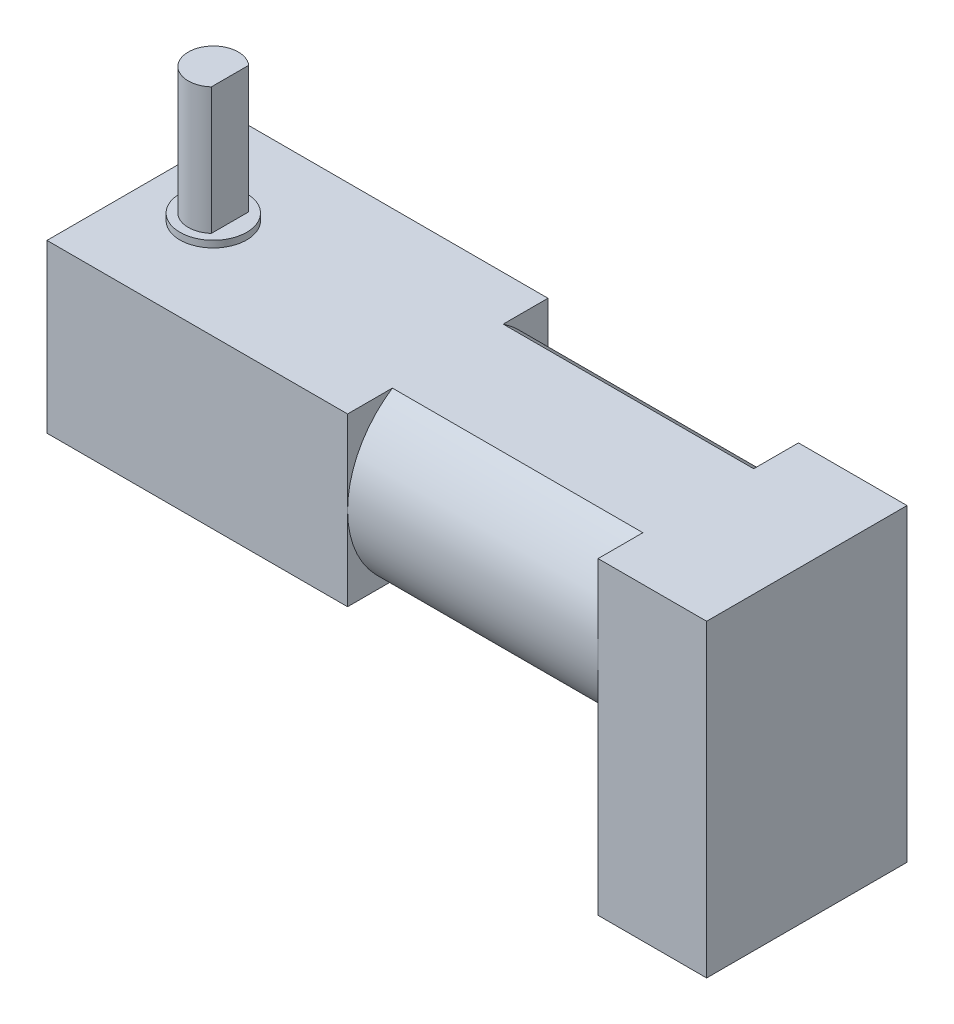
ISO-10303-21;
HEADER;
FILE_DESCRIPTION(('STEP AP214'),'2;1');
FILE_NAME('part.step','',(''),(''),'','','');
FILE_SCHEMA(('AUTOMOTIVE_DESIGN { 1 0 10303 214 1 1 1 1 }'));
ENDSEC;
DATA;
#1=APPLICATION_CONTEXT('core data for automotive mechanical design processes');
#2=APPLICATION_PROTOCOL_DEFINITION('international standard','automotive_design',2000,#1);
#3=PRODUCT_CONTEXT('',#1,'mechanical');
#4=PRODUCT('Part','Part','',(#3));
#5=PRODUCT_RELATED_PRODUCT_CATEGORY('part','',(#4));
#6=PRODUCT_DEFINITION_FORMATION('','',#4);
#7=PRODUCT_DEFINITION_CONTEXT('part definition',#1,'design');
#8=PRODUCT_DEFINITION('design','',#6,#7);
#9=PRODUCT_DEFINITION_SHAPE('','',#8);
#10=(LENGTH_UNIT() NAMED_UNIT(*) SI_UNIT(.MILLI.,.METRE.));
#11=(NAMED_UNIT(*) PLANE_ANGLE_UNIT() SI_UNIT($,.RADIAN.));
#12=(NAMED_UNIT(*) SI_UNIT($,.STERADIAN.) SOLID_ANGLE_UNIT());
#13=UNCERTAINTY_MEASURE_WITH_UNIT(LENGTH_MEASURE(1.E-05),#10,'distance_accuracy_value','');
#14=(GEOMETRIC_REPRESENTATION_CONTEXT(3) GLOBAL_UNCERTAINTY_ASSIGNED_CONTEXT((#13)) GLOBAL_UNIT_ASSIGNED_CONTEXT((#10,
#11,#12)) REPRESENTATION_CONTEXT('',''));
#15=CARTESIAN_POINT('',(0.,0.,0.));
#16=DIRECTION('',(0.,0.,1.));
#17=DIRECTION('',(1.,0.,0.));
#18=AXIS2_PLACEMENT_3D('',#15,#16,#17);
#19=CARTESIAN_POINT('',(18.,10.,0.));
#20=DIRECTION('',(-1.,0.,0.));
#21=DIRECTION('',(0.,0.,1.));
#22=AXIS2_PLACEMENT_3D('',#19,#20,#21);
#23=PLANE('',#22);
#24=CARTESIAN_POINT('',(18.,5.,-6.));
#25=DIRECTION('',(1.,0.,0.));
#26=DIRECTION('',(0.,0.,-1.));
#27=AXIS2_PLACEMENT_3D('',#24,#25,#26);
#28=CIRCLE('',#27,6.);
#29=CARTESIAN_POINT('',(18.,10.,-2.6833752096446));
#30=VERTEX_POINT('',#29);
#31=CARTESIAN_POINT('',(18.,5.,0.));
#32=VERTEX_POINT('',#31);
#33=EDGE_CURVE('E209',#30,#32,#28,.T.);
#34=ORIENTED_EDGE('',*,*,#33,.F.);
#35=DIRECTION('',(0.,0.,-1.));
#36=VECTOR('',#35,1.);
#37=CARTESIAN_POINT('',(18.,10.,0.));
#38=LINE('',#37,#36);
#39=CARTESIAN_POINT('',(18.,10.,0.));
#40=VERTEX_POINT('',#39);
#41=EDGE_CURVE('E243',#40,#30,#38,.T.);
#42=ORIENTED_EDGE('',*,*,#41,.F.);
#43=DIRECTION('',(0.,-1.,0.));
#44=VECTOR('',#43,1.);
#45=CARTESIAN_POINT('',(18.,10.,0.));
#46=LINE('',#45,#44);
#47=EDGE_CURVE('E265',#40,#32,#46,.T.);
#48=ORIENTED_EDGE('',*,*,#47,.T.);
#49=EDGE_LOOP('',(#34,#42,#48));
#50=FACE_BOUND('',#49,.T.);
#51=ADVANCED_FACE('F41',(#50),#23,.F.);
#52=CARTESIAN_POINT('',(18.,0.,-2.6833752096446));
#53=VERTEX_POINT('',#52);
#54=EDGE_CURVE('E49',#32,#53,#28,.T.);
#55=ORIENTED_EDGE('',*,*,#54,.F.);
#56=CARTESIAN_POINT('',(18.,0.,0.));
#57=VERTEX_POINT('',#56);
#58=EDGE_CURVE('E264',#32,#57,#46,.T.);
#59=ORIENTED_EDGE('',*,*,#58,.T.);
#60=DIRECTION('',(0.,0.,-1.));
#61=VECTOR('',#60,1.);
#62=CARTESIAN_POINT('',(18.,0.,0.));
#63=LINE('',#62,#61);
#64=EDGE_CURVE('E255',#57,#53,#63,.T.);
#65=ORIENTED_EDGE('',*,*,#64,.T.);
#66=EDGE_LOOP('',(#55,#59,#65));
#67=FACE_BOUND('',#66,.T.);
#68=ADVANCED_FACE('F322',(#67),#23,.F.);
#69=CARTESIAN_POINT('',(18.,5.,-6.));
#70=DIRECTION('',(1.,0.,0.));
#71=DIRECTION('',(0.,0.,-1.));
#72=AXIS2_PLACEMENT_3D('',#69,#70,#71);
#73=CIRCLE('',#72,6.);
#74=CARTESIAN_POINT('',(18.,0.,-9.3166247903554));
#75=VERTEX_POINT('',#74);
#76=CARTESIAN_POINT('',(18.,5.,-12.));
#77=VERTEX_POINT('',#76);
#78=EDGE_CURVE('E220',#75,#77,#73,.T.);
#79=ORIENTED_EDGE('',*,*,#78,.F.);
#80=CARTESIAN_POINT('',(18.,0.,-12.));
#81=VERTEX_POINT('',#80);
#82=EDGE_CURVE('E254',#75,#81,#63,.T.);
#83=ORIENTED_EDGE('',*,*,#82,.T.);
#84=DIRECTION('',(0.,-1.,0.));
#85=VECTOR('',#84,1.);
#86=CARTESIAN_POINT('',(18.,10.,-12.));
#87=LINE('',#86,#85);
#88=EDGE_CURVE('E260',#77,#81,#87,.T.);
#89=ORIENTED_EDGE('',*,*,#88,.F.);
#90=EDGE_LOOP('',(#79,#83,#89));
#91=FACE_BOUND('',#90,.T.);
#92=ADVANCED_FACE('F329',(#91),#23,.F.);
#93=CARTESIAN_POINT('',(0.,10.,0.));
#94=DIRECTION('',(1.,0.,0.));
#95=DIRECTION('',(0.,0.,-1.));
#96=AXIS2_PLACEMENT_3D('',#93,#94,#95);
#97=PLANE('',#96);
#98=DIRECTION('',(0.,0.,1.));
#99=VECTOR('',#98,1.);
#100=CARTESIAN_POINT('',(0.,0.,0.));
#101=LINE('',#100,#99);
#102=CARTESIAN_POINT('',(0.,0.,-12.));
#103=VERTEX_POINT('',#102);
#104=CARTESIAN_POINT('',(0.,0.,0.));
#105=VERTEX_POINT('',#104);
#106=EDGE_CURVE('E235',#103,#105,#101,.T.);
#107=ORIENTED_EDGE('',*,*,#106,.T.);
#108=DIRECTION('',(0.,-1.,0.));
#109=VECTOR('',#108,1.);
#110=CARTESIAN_POINT('',(0.,10.,0.));
#111=LINE('',#110,#109);
#112=CARTESIAN_POINT('',(0.,10.,0.));
#113=VERTEX_POINT('',#112);
#114=EDGE_CURVE('E267',#113,#105,#111,.T.);
#115=ORIENTED_EDGE('',*,*,#114,.F.);
#116=DIRECTION('',(0.,0.,1.));
#117=VECTOR('',#116,1.);
#118=CARTESIAN_POINT('',(0.,10.,0.));
#119=LINE('',#118,#117);
#120=CARTESIAN_POINT('',(0.,10.,-12.));
#121=VERTEX_POINT('',#120);
#122=EDGE_CURVE('E236',#121,#113,#119,.T.);
#123=ORIENTED_EDGE('',*,*,#122,.F.);
#124=DIRECTION('',(0.,-1.,0.));
#125=VECTOR('',#124,1.);
#126=CARTESIAN_POINT('',(0.,10.,-12.));
#127=LINE('',#126,#125);
#128=EDGE_CURVE('E248',#121,#103,#127,.T.);
#129=ORIENTED_EDGE('',*,*,#128,.T.);
#130=EDGE_LOOP('',(#107,#115,#123,#129));
#131=FACE_BOUND('',#130,.T.);
#132=ADVANCED_FACE('F43',(#131),#97,.F.);
#133=CARTESIAN_POINT('',(0.,10.,0.));
#134=DIRECTION('',(0.,0.,-1.));
#135=DIRECTION('',(-1.,0.,0.));
#136=AXIS2_PLACEMENT_3D('',#133,#134,#135);
#137=PLANE('',#136);
#138=DIRECTION('',(1.,0.,0.));
#139=VECTOR('',#138,1.);
#140=CARTESIAN_POINT('',(0.,0.,0.));
#141=LINE('',#140,#139);
#142=EDGE_CURVE('E251',#105,#57,#141,.T.);
#143=ORIENTED_EDGE('',*,*,#142,.T.);
#144=ORIENTED_EDGE('',*,*,#58,.F.);
#145=ORIENTED_EDGE('',*,*,#47,.F.);
#146=DIRECTION('',(1.,0.,0.));
#147=VECTOR('',#146,1.);
#148=CARTESIAN_POINT('',(0.,10.,0.));
#149=LINE('',#148,#147);
#150=EDGE_CURVE('E239',#113,#40,#149,.T.);
#151=ORIENTED_EDGE('',*,*,#150,.F.);
#152=ORIENTED_EDGE('',*,*,#114,.T.);
#153=EDGE_LOOP('',(#143,#144,#145,#151,#152));
#154=FACE_BOUND('',#153,.T.);
#155=ADVANCED_FACE('F333',(#154),#137,.F.);
#156=CARTESIAN_POINT('',(18.,10.,-9.3166247903554));
#157=VERTEX_POINT('',#156);
#158=EDGE_CURVE('E223',#77,#157,#73,.T.);
#159=ORIENTED_EDGE('',*,*,#158,.F.);
#160=CARTESIAN_POINT('',(18.,10.,-12.));
#161=VERTEX_POINT('',#160);
#162=EDGE_CURVE('E261',#161,#77,#87,.T.);
#163=ORIENTED_EDGE('',*,*,#162,.F.);
#164=EDGE_CURVE('E242',#157,#161,#38,.T.);
#165=ORIENTED_EDGE('',*,*,#164,.F.);
#166=EDGE_LOOP('',(#159,#163,#165));
#167=FACE_BOUND('',#166,.T.);
#168=ADVANCED_FACE('F325',(#167),#23,.F.);
#169=CARTESIAN_POINT('',(0.,10.,-12.));
#170=DIRECTION('',(0.,0.,1.));
#171=DIRECTION('',(1.,0.,0.));
#172=AXIS2_PLACEMENT_3D('',#169,#170,#171);
#173=PLANE('',#172);
#174=DIRECTION('',(-1.,0.,0.));
#175=VECTOR('',#174,1.);
#176=CARTESIAN_POINT('',(0.,0.,-12.));
#177=LINE('',#176,#175);
#178=EDGE_CURVE('E240',#81,#103,#177,.T.);
#179=ORIENTED_EDGE('',*,*,#178,.T.);
#180=ORIENTED_EDGE('',*,*,#128,.F.);
#181=DIRECTION('',(-1.,0.,0.));
#182=VECTOR('',#181,1.);
#183=CARTESIAN_POINT('',(0.,10.,-12.));
#184=LINE('',#183,#182);
#185=EDGE_CURVE('E246',#161,#121,#184,.T.);
#186=ORIENTED_EDGE('',*,*,#185,.F.);
#187=ORIENTED_EDGE('',*,*,#162,.T.);
#188=ORIENTED_EDGE('',*,*,#88,.T.);
#189=EDGE_LOOP('',(#179,#180,#186,#187,#188));
#190=FACE_BOUND('',#189,.T.);
#191=ADVANCED_FACE('F332',(#190),#173,.F.);
#192=CARTESIAN_POINT('',(0.,10.,0.));
#193=DIRECTION('',(0.,-1.,0.));
#194=DIRECTION('',(0.,0.,-1.));
#195=AXIS2_PLACEMENT_3D('',#192,#193,#194);
#196=PLANE('',#195);
#197=CARTESIAN_POINT('',(3.96,10.,-6.));
#198=DIRECTION('',(0.,-1.,0.));
#199=DIRECTION('',(0.,0.,-1.));
#200=AXIS2_PLACEMENT_3D('',#197,#198,#199);
#201=CIRCLE('',#200,2.);
#202=CARTESIAN_POINT('',(3.96,10.,-8.));
#203=VERTEX_POINT('',#202);
#204=EDGE_CURVE('E12',#203,#203,#201,.F.);
#205=ORIENTED_EDGE('',*,*,#204,.F.);
#206=EDGE_LOOP('',(#205));
#207=FACE_BOUND('',#206,.T.);
#208=ORIENTED_EDGE('',*,*,#122,.T.);
#209=ORIENTED_EDGE('',*,*,#150,.T.);
#210=ORIENTED_EDGE('',*,*,#41,.T.);
#211=DIRECTION('',(-1.,0.,0.));
#212=VECTOR('',#211,1.);
#213=CARTESIAN_POINT('',(33.,10.,-2.6833752096446));
#214=LINE('',#213,#212);
#215=CARTESIAN_POINT('',(33.,10.,-2.6833752096446));
#216=VERTEX_POINT('',#215);
#217=EDGE_CURVE('E217',#216,#30,#214,.T.);
#218=ORIENTED_EDGE('',*,*,#217,.F.);
#219=DIRECTION('',(0.,0.,1.));
#220=VECTOR('',#219,1.);
#221=CARTESIAN_POINT('',(33.,10.,0.));
#222=LINE('',#221,#220);
#223=CARTESIAN_POINT('',(33.,10.,0.));
#224=VERTEX_POINT('',#223);
#225=EDGE_CURVE('E300',#216,#224,#222,.T.);
#226=ORIENTED_EDGE('',*,*,#225,.T.);
#227=DIRECTION('',(-1.,0.,0.));
#228=VECTOR('',#227,1.);
#229=CARTESIAN_POINT('',(39.5,10.,0.));
#230=LINE('',#229,#228);
#231=CARTESIAN_POINT('',(39.5,10.,0.));
#232=VERTEX_POINT('',#231);
#233=EDGE_CURVE('E289',#232,#224,#230,.T.);
#234=ORIENTED_EDGE('',*,*,#233,.F.);
#235=DIRECTION('',(0.,0.,1.));
#236=VECTOR('',#235,1.);
#237=CARTESIAN_POINT('',(39.5,10.,0.));
#238=LINE('',#237,#236);
#239=CARTESIAN_POINT('',(39.5,10.,-12.));
#240=VERTEX_POINT('',#239);
#241=EDGE_CURVE('E172',#240,#232,#238,.T.);
#242=ORIENTED_EDGE('',*,*,#241,.F.);
#243=DIRECTION('',(-1.,0.,0.));
#244=VECTOR('',#243,1.);
#245=CARTESIAN_POINT('',(39.5,10.,-12.));
#246=LINE('',#245,#244);
#247=CARTESIAN_POINT('',(33.,10.,-12.));
#248=VERTEX_POINT('',#247);
#249=EDGE_CURVE('E188',#240,#248,#246,.T.);
#250=ORIENTED_EDGE('',*,*,#249,.T.);
#251=CARTESIAN_POINT('',(33.,10.,-9.3166247903554));
#252=VERTEX_POINT('',#251);
#253=EDGE_CURVE('E176',#248,#252,#222,.T.);
#254=ORIENTED_EDGE('',*,*,#253,.T.);
#255=DIRECTION('',(-1.,0.,0.));
#256=VECTOR('',#255,1.);
#257=CARTESIAN_POINT('',(33.,10.,-9.3166247903554));
#258=LINE('',#257,#256);
#259=EDGE_CURVE('E226',#252,#157,#258,.T.);
#260=ORIENTED_EDGE('',*,*,#259,.T.);
#261=ORIENTED_EDGE('',*,*,#164,.T.);
#262=ORIENTED_EDGE('',*,*,#185,.T.);
#263=EDGE_LOOP('',(#208,#209,#210,#218,#226,#234,#242,#250,#254,#260,#261,#262));
#264=FACE_BOUND('',#263,.T.);
#265=ADVANCED_FACE('F307',(#207,#264),#196,.F.);
#266=CARTESIAN_POINT('',(0.,0.,0.));
#267=DIRECTION('',(0.,-1.,0.));
#268=DIRECTION('',(0.,0.,-1.));
#269=AXIS2_PLACEMENT_3D('',#266,#267,#268);
#270=PLANE('',#269);
#271=ORIENTED_EDGE('',*,*,#106,.F.);
#272=ORIENTED_EDGE('',*,*,#178,.F.);
#273=ORIENTED_EDGE('',*,*,#82,.F.);
#274=DIRECTION('',(-1.,0.,0.));
#275=VECTOR('',#274,1.);
#276=CARTESIAN_POINT('',(33.,0.,-9.3166247903554));
#277=LINE('',#276,#275);
#278=CARTESIAN_POINT('',(33.,0.,-9.3166247903554));
#279=VERTEX_POINT('',#278);
#280=EDGE_CURVE('E229',#279,#75,#277,.T.);
#281=ORIENTED_EDGE('',*,*,#280,.F.);
#282=DIRECTION('',(0.,0.,-1.));
#283=VECTOR('',#282,1.);
#284=CARTESIAN_POINT('',(33.,0.,-2.6833752096446));
#285=LINE('',#284,#283);
#286=CARTESIAN_POINT('',(33.,0.,-2.6833752096446));
#287=VERTEX_POINT('',#286);
#288=EDGE_CURVE('E212',#287,#279,#285,.T.);
#289=ORIENTED_EDGE('',*,*,#288,.F.);
#290=DIRECTION('',(-1.,0.,0.));
#291=VECTOR('',#290,1.);
#292=CARTESIAN_POINT('',(33.,0.,-2.6833752096446));
#293=LINE('',#292,#291);
#294=EDGE_CURVE('E232',#287,#53,#293,.T.);
#295=ORIENTED_EDGE('',*,*,#294,.T.);
#296=ORIENTED_EDGE('',*,*,#64,.F.);
#297=ORIENTED_EDGE('',*,*,#142,.F.);
#298=EDGE_LOOP('',(#271,#272,#273,#281,#289,#295,#296,#297));
#299=FACE_BOUND('',#298,.T.);
#300=ADVANCED_FACE('F279',(#299),#270,.T.);
#301=CARTESIAN_POINT('',(33.,5.,-6.));
#302=DIRECTION('',(-1.,0.,0.));
#303=DIRECTION('',(0.,0.,1.));
#304=AXIS2_PLACEMENT_3D('',#301,#302,#303);
#305=CYLINDRICAL_SURFACE('',#304,6.);
#306=ORIENTED_EDGE('',*,*,#33,.T.);
#307=ORIENTED_EDGE('',*,*,#54,.T.);
#308=ORIENTED_EDGE('',*,*,#294,.F.);
#309=CARTESIAN_POINT('',(33.,5.,-6.));
#310=DIRECTION('',(1.,0.,0.));
#311=DIRECTION('',(0.,0.,-1.));
#312=AXIS2_PLACEMENT_3D('',#309,#310,#311);
#313=CIRCLE('',#312,6.);
#314=CARTESIAN_POINT('',(33.,5.,0.));
#315=VERTEX_POINT('',#314);
#316=EDGE_CURVE('E64',#315,#287,#313,.T.);
#317=ORIENTED_EDGE('',*,*,#316,.F.);
#318=EDGE_CURVE('E210',#216,#315,#313,.T.);
#319=ORIENTED_EDGE('',*,*,#318,.F.);
#320=ORIENTED_EDGE('',*,*,#217,.T.);
#321=EDGE_LOOP('',(#306,#307,#308,#317,#319,#320));
#322=FACE_BOUND('',#321,.T.);
#323=ADVANCED_FACE('F273',(#322),#305,.T.);
#324=CARTESIAN_POINT('',(33.,5.,-6.));
#325=DIRECTION('',(-1.,0.,0.));
#326=DIRECTION('',(0.,0.,1.));
#327=AXIS2_PLACEMENT_3D('',#324,#325,#326);
#328=CYLINDRICAL_SURFACE('',#327,6.);
#329=ORIENTED_EDGE('',*,*,#78,.T.);
#330=ORIENTED_EDGE('',*,*,#158,.T.);
#331=ORIENTED_EDGE('',*,*,#259,.F.);
#332=CARTESIAN_POINT('',(33.,5.,-6.));
#333=DIRECTION('',(1.,0.,0.));
#334=DIRECTION('',(0.,0.,-1.));
#335=AXIS2_PLACEMENT_3D('',#332,#333,#334);
#336=CIRCLE('',#335,6.);
#337=CARTESIAN_POINT('',(33.,5.,-12.));
#338=VERTEX_POINT('',#337);
#339=EDGE_CURVE('E56',#338,#252,#336,.T.);
#340=ORIENTED_EDGE('',*,*,#339,.F.);
#341=EDGE_CURVE('E215',#279,#338,#336,.T.);
#342=ORIENTED_EDGE('',*,*,#341,.F.);
#343=ORIENTED_EDGE('',*,*,#280,.T.);
#344=EDGE_LOOP('',(#329,#330,#331,#340,#342,#343));
#345=FACE_BOUND('',#344,.T.);
#346=ADVANCED_FACE('F349',(#345),#328,.T.);
#347=CARTESIAN_POINT('',(3.96,10.4,-6.));
#348=DIRECTION('',(0.,-1.,0.));
#349=DIRECTION('',(0.,0.,-1.));
#350=AXIS2_PLACEMENT_3D('',#347,#348,#349);
#351=CYLINDRICAL_SURFACE('',#350,2.);
#352=CARTESIAN_POINT('',(3.96,10.4,-6.));
#353=DIRECTION('',(0.,1.,0.));
#354=DIRECTION('',(0.,0.,1.));
#355=AXIS2_PLACEMENT_3D('',#352,#353,#354);
#356=CIRCLE('',#355,2.);
#357=CARTESIAN_POINT('',(3.96,10.4,-4.));
#358=VERTEX_POINT('',#357);
#359=EDGE_CURVE('E194',#358,#358,#356,.T.);
#360=ORIENTED_EDGE('',*,*,#359,.F.);
#361=EDGE_LOOP('',(#360));
#362=FACE_BOUND('',#361,.T.);
#363=ORIENTED_EDGE('',*,*,#204,.T.);
#364=EDGE_LOOP('',(#363));
#365=FACE_BOUND('',#364,.T.);
#366=ADVANCED_FACE('F351',(#362,#365),#351,.T.);
#367=CARTESIAN_POINT('',(3.96,10.4,-6.));
#368=DIRECTION('',(0.,1.,0.));
#369=DIRECTION('',(0.,0.,1.));
#370=AXIS2_PLACEMENT_3D('',#367,#368,#369);
#371=PLANE('',#370);
#372=CARTESIAN_POINT('',(3.96,10.4,-6.));
#373=DIRECTION('',(0.,1.,0.));
#374=DIRECTION('',(0.,0.,1.));
#375=AXIS2_PLACEMENT_3D('',#372,#373,#374);
#376=CIRCLE('',#375,1.5);
#377=CARTESIAN_POINT('',(4.96,10.4,-7.1180339887499));
#378=VERTEX_POINT('',#377);
#379=CARTESIAN_POINT('',(4.96,10.4,-4.88196601125011));
#380=VERTEX_POINT('',#379);
#381=EDGE_CURVE('E183',#378,#380,#376,.T.);
#382=ORIENTED_EDGE('',*,*,#381,.F.);
#383=DIRECTION('',(0.,0.,-1.));
#384=VECTOR('',#383,1.);
#385=CARTESIAN_POINT('',(4.96,10.4,-4.88196601125011));
#386=LINE('',#385,#384);
#387=EDGE_CURVE('E186',#380,#378,#386,.T.);
#388=ORIENTED_EDGE('',*,*,#387,.F.);
#389=EDGE_LOOP('',(#382,#388));
#390=FACE_BOUND('',#389,.T.);
#391=ORIENTED_EDGE('',*,*,#359,.T.);
#392=EDGE_LOOP('',(#391));
#393=FACE_BOUND('',#392,.T.);
#394=ADVANCED_FACE('F357',(#390,#393),#371,.T.);
#395=CARTESIAN_POINT('',(4.96,29.9051248379533,-4.88196601125011));
#396=DIRECTION('',(-1.,0.,0.));
#397=DIRECTION('',(0.,0.,1.));
#398=AXIS2_PLACEMENT_3D('',#395,#396,#397);
#399=PLANE('',#398);
#400=DIRECTION('',(0.,-1.,0.));
#401=VECTOR('',#400,1.);
#402=CARTESIAN_POINT('',(4.96,29.9051248379533,-7.1180339887499));
#403=LINE('',#402,#401);
#404=CARTESIAN_POINT('',(4.96,18.,-7.1180339887499));
#405=VERTEX_POINT('',#404);
#406=EDGE_CURVE('E199',#405,#378,#403,.T.);
#407=ORIENTED_EDGE('',*,*,#406,.F.);
#408=DIRECTION('',(0.,0.,1.));
#409=VECTOR('',#408,1.);
#410=CARTESIAN_POINT('',(4.96,18.,-4.88196601125011));
#411=LINE('',#410,#409);
#412=CARTESIAN_POINT('',(4.96,18.,-4.88196601125011));
#413=VERTEX_POINT('',#412);
#414=EDGE_CURVE('E195',#405,#413,#411,.T.);
#415=ORIENTED_EDGE('',*,*,#414,.T.);
#416=DIRECTION('',(0.,-1.,0.));
#417=VECTOR('',#416,1.);
#418=CARTESIAN_POINT('',(4.96,29.9051248379533,-4.88196601125011));
#419=LINE('',#418,#417);
#420=EDGE_CURVE('E202',#413,#380,#419,.T.);
#421=ORIENTED_EDGE('',*,*,#420,.T.);
#422=ORIENTED_EDGE('',*,*,#387,.T.);
#423=EDGE_LOOP('',(#407,#415,#421,#422));
#424=FACE_BOUND('',#423,.T.);
#425=ADVANCED_FACE('F463',(#424),#399,.F.);
#426=CARTESIAN_POINT('',(3.96,29.9051248379533,-6.));
#427=DIRECTION('',(0.,-1.,0.));
#428=DIRECTION('',(0.,0.,-1.));
#429=AXIS2_PLACEMENT_3D('',#426,#427,#428);
#430=CYLINDRICAL_SURFACE('',#429,1.5);
#431=ORIENTED_EDGE('',*,*,#420,.F.);
#432=CARTESIAN_POINT('',(3.96,18.,-6.));
#433=DIRECTION('',(0.,-1.,0.));
#434=DIRECTION('',(0.,0.,-1.));
#435=AXIS2_PLACEMENT_3D('',#432,#433,#434);
#436=CIRCLE('',#435,1.5);
#437=EDGE_CURVE('E192',#413,#405,#436,.T.);
#438=ORIENTED_EDGE('',*,*,#437,.T.);
#439=ORIENTED_EDGE('',*,*,#406,.T.);
#440=ORIENTED_EDGE('',*,*,#381,.T.);
#441=EDGE_LOOP('',(#431,#438,#439,#440));
#442=FACE_BOUND('',#441,.T.);
#443=ADVANCED_FACE('F453',(#442),#430,.T.);
#444=CARTESIAN_POINT('',(0.,18.,0.));
#445=DIRECTION('',(0.,-1.,0.));
#446=DIRECTION('',(0.,0.,-1.));
#447=AXIS2_PLACEMENT_3D('',#444,#445,#446);
#448=PLANE('',#447);
#449=ORIENTED_EDGE('',*,*,#414,.F.);
#450=ORIENTED_EDGE('',*,*,#437,.F.);
#451=EDGE_LOOP('',(#449,#450));
#452=FACE_BOUND('',#451,.T.);
#453=ADVANCED_FACE('F392',(#452),#448,.F.);
#454=CARTESIAN_POINT('',(33.,0.,0.));
#455=DIRECTION('',(1.,0.,0.));
#456=DIRECTION('',(0.,0.,-1.));
#457=AXIS2_PLACEMENT_3D('',#454,#455,#456);
#458=PLANE('',#457);
#459=ORIENTED_EDGE('',*,*,#225,.F.);
#460=ORIENTED_EDGE('',*,*,#318,.T.);
#461=DIRECTION('',(0.,-1.,0.));
#462=VECTOR('',#461,1.);
#463=CARTESIAN_POINT('',(33.,10.,0.));
#464=LINE('',#463,#462);
#465=EDGE_CURVE('E286',#224,#315,#464,.T.);
#466=ORIENTED_EDGE('',*,*,#465,.F.);
#467=EDGE_LOOP('',(#459,#460,#466));
#468=FACE_BOUND('',#467,.T.);
#469=ADVANCED_FACE('F387',(#468),#458,.F.);
#470=CARTESIAN_POINT('',(33.,-8.5,0.));
#471=VERTEX_POINT('',#470);
#472=EDGE_CURVE('E181',#315,#471,#464,.T.);
#473=ORIENTED_EDGE('',*,*,#472,.F.);
#474=ORIENTED_EDGE('',*,*,#316,.T.);
#475=ORIENTED_EDGE('',*,*,#288,.T.);
#476=ORIENTED_EDGE('',*,*,#341,.T.);
#477=DIRECTION('',(0.,1.,0.));
#478=VECTOR('',#477,1.);
#479=CARTESIAN_POINT('',(33.,10.,-12.));
#480=LINE('',#479,#478);
#481=CARTESIAN_POINT('',(33.,-8.5,-12.));
#482=VERTEX_POINT('',#481);
#483=EDGE_CURVE('E297',#482,#338,#480,.T.);
#484=ORIENTED_EDGE('',*,*,#483,.F.);
#485=DIRECTION('',(0.,0.,-1.));
#486=VECTOR('',#485,1.);
#487=CARTESIAN_POINT('',(33.,-8.5,0.));
#488=LINE('',#487,#486);
#489=EDGE_CURVE('E285',#471,#482,#488,.T.);
#490=ORIENTED_EDGE('',*,*,#489,.F.);
#491=EDGE_LOOP('',(#473,#474,#475,#476,#484,#490));
#492=FACE_BOUND('',#491,.T.);
#493=ADVANCED_FACE('F282',(#492),#458,.F.);
#494=EDGE_CURVE('E292',#338,#248,#480,.T.);
#495=ORIENTED_EDGE('',*,*,#494,.F.);
#496=ORIENTED_EDGE('',*,*,#339,.T.);
#497=ORIENTED_EDGE('',*,*,#253,.F.);
#498=EDGE_LOOP('',(#495,#496,#497));
#499=FACE_BOUND('',#498,.T.);
#500=ADVANCED_FACE('F310',(#499),#458,.F.);
#501=CARTESIAN_POINT('',(39.5,10.,0.));
#502=DIRECTION('',(0.,0.,-1.));
#503=DIRECTION('',(0.,1.,0.));
#504=AXIS2_PLACEMENT_3D('',#501,#502,#503);
#505=PLANE('',#504);
#506=ORIENTED_EDGE('',*,*,#465,.T.);
#507=ORIENTED_EDGE('',*,*,#472,.T.);
#508=DIRECTION('',(-1.,0.,0.));
#509=VECTOR('',#508,1.);
#510=CARTESIAN_POINT('',(39.5,-8.5,0.));
#511=LINE('',#510,#509);
#512=CARTESIAN_POINT('',(39.5,-8.5,0.));
#513=VERTEX_POINT('',#512);
#514=EDGE_CURVE('E161',#513,#471,#511,.T.);
#515=ORIENTED_EDGE('',*,*,#514,.F.);
#516=DIRECTION('',(0.,-1.,0.));
#517=VECTOR('',#516,1.);
#518=CARTESIAN_POINT('',(39.5,10.,0.));
#519=LINE('',#518,#517);
#520=EDGE_CURVE('E167',#232,#513,#519,.T.);
#521=ORIENTED_EDGE('',*,*,#520,.F.);
#522=ORIENTED_EDGE('',*,*,#233,.T.);
#523=EDGE_LOOP('',(#506,#507,#515,#521,#522));
#524=FACE_BOUND('',#523,.T.);
#525=ADVANCED_FACE('F179',(#524),#505,.F.);
#526=CARTESIAN_POINT('',(39.5,-8.5,0.));
#527=DIRECTION('',(0.,1.,0.));
#528=DIRECTION('',(0.,0.,1.));
#529=AXIS2_PLACEMENT_3D('',#526,#527,#528);
#530=PLANE('',#529);
#531=ORIENTED_EDGE('',*,*,#489,.T.);
#532=DIRECTION('',(-1.,0.,0.));
#533=VECTOR('',#532,1.);
#534=CARTESIAN_POINT('',(39.5,-8.5,-12.));
#535=LINE('',#534,#533);
#536=CARTESIAN_POINT('',(39.5,-8.5,-12.));
#537=VERTEX_POINT('',#536);
#538=EDGE_CURVE('E163',#537,#482,#535,.T.);
#539=ORIENTED_EDGE('',*,*,#538,.F.);
#540=DIRECTION('',(0.,0.,-1.));
#541=VECTOR('',#540,1.);
#542=CARTESIAN_POINT('',(39.5,-8.5,0.));
#543=LINE('',#542,#541);
#544=EDGE_CURVE('E157',#513,#537,#543,.T.);
#545=ORIENTED_EDGE('',*,*,#544,.F.);
#546=ORIENTED_EDGE('',*,*,#514,.T.);
#547=EDGE_LOOP('',(#531,#539,#545,#546));
#548=FACE_BOUND('',#547,.T.);
#549=ADVANCED_FACE('F159',(#548),#530,.F.);
#550=CARTESIAN_POINT('',(39.5,10.,-12.));
#551=DIRECTION('',(0.,0.,1.));
#552=DIRECTION('',(0.,-1.,0.));
#553=AXIS2_PLACEMENT_3D('',#550,#551,#552);
#554=PLANE('',#553);
#555=ORIENTED_EDGE('',*,*,#483,.T.);
#556=ORIENTED_EDGE('',*,*,#494,.T.);
#557=ORIENTED_EDGE('',*,*,#249,.F.);
#558=DIRECTION('',(0.,1.,0.));
#559=VECTOR('',#558,1.);
#560=CARTESIAN_POINT('',(39.5,10.,-12.));
#561=LINE('',#560,#559);
#562=EDGE_CURVE('E166',#537,#240,#561,.T.);
#563=ORIENTED_EDGE('',*,*,#562,.F.);
#564=ORIENTED_EDGE('',*,*,#538,.T.);
#565=EDGE_LOOP('',(#555,#556,#557,#563,#564));
#566=FACE_BOUND('',#565,.T.);
#567=ADVANCED_FACE('F311',(#566),#554,.F.);
#568=CARTESIAN_POINT('',(39.5,0.,0.));
#569=DIRECTION('',(1.,0.,0.));
#570=DIRECTION('',(0.,0.,-1.));
#571=AXIS2_PLACEMENT_3D('',#568,#569,#570);
#572=PLANE('',#571);
#573=ORIENTED_EDGE('',*,*,#520,.T.);
#574=ORIENTED_EDGE('',*,*,#544,.T.);
#575=ORIENTED_EDGE('',*,*,#562,.T.);
#576=ORIENTED_EDGE('',*,*,#241,.T.);
#577=EDGE_LOOP('',(#573,#574,#575,#576));
#578=FACE_BOUND('',#577,.T.);
#579=ADVANCED_FACE('F170',(#578),#572,.T.);
#580=CLOSED_SHELL('',(#51,#68,#92,#132,#155,#168,#191,#265,#300,#323,#346,#366,#394,#425,#443,
#453,#469,#493,#500,#525,#549,#567,#579));
#581=MANIFOLD_SOLID_BREP('B2',#580);
#582=ADVANCED_BREP_SHAPE_REPRESENTATION('',(#18,#581),#14);
#583=SHAPE_DEFINITION_REPRESENTATION(#9,#582);
ENDSEC;
END-ISO-10303-21;
